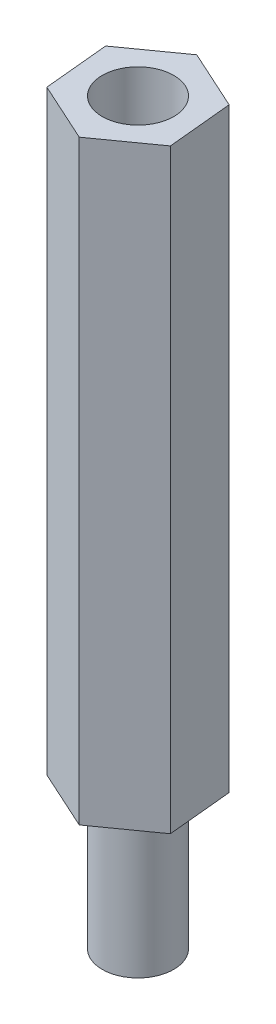
ISO-10303-21;
HEADER;
FILE_DESCRIPTION(('STEP AP214'),'2;1');
FILE_NAME('part.step','',(''),(''),'','','');
FILE_SCHEMA(('AUTOMOTIVE_DESIGN { 1 0 10303 214 1 1 1 1 }'));
ENDSEC;
DATA;
#1=APPLICATION_CONTEXT('core data for automotive mechanical design processes');
#2=APPLICATION_PROTOCOL_DEFINITION('international standard','automotive_design',2000,#1);
#3=PRODUCT_CONTEXT('',#1,'mechanical');
#4=PRODUCT('Part','Part','',(#3));
#5=PRODUCT_RELATED_PRODUCT_CATEGORY('part','',(#4));
#6=PRODUCT_DEFINITION_FORMATION('','',#4);
#7=PRODUCT_DEFINITION_CONTEXT('part definition',#1,'design');
#8=PRODUCT_DEFINITION('design','',#6,#7);
#9=PRODUCT_DEFINITION_SHAPE('','',#8);
#10=(LENGTH_UNIT() NAMED_UNIT(*) SI_UNIT(.MILLI.,.METRE.));
#11=(NAMED_UNIT(*) PLANE_ANGLE_UNIT() SI_UNIT($,.RADIAN.));
#12=(NAMED_UNIT(*) SI_UNIT($,.STERADIAN.) SOLID_ANGLE_UNIT());
#13=UNCERTAINTY_MEASURE_WITH_UNIT(LENGTH_MEASURE(1.E-05),#10,'distance_accuracy_value','');
#14=(GEOMETRIC_REPRESENTATION_CONTEXT(3) GLOBAL_UNCERTAINTY_ASSIGNED_CONTEXT((#13)) GLOBAL_UNIT_ASSIGNED_CONTEXT((#10,
#11,#12)) REPRESENTATION_CONTEXT('',''));
#15=CARTESIAN_POINT('',(0.,0.,0.));
#16=DIRECTION('',(0.,0.,1.));
#17=DIRECTION('',(1.,0.,0.));
#18=AXIS2_PLACEMENT_3D('',#15,#16,#17);
#19=CARTESIAN_POINT('',(0.,6.,0.));
#20=DIRECTION('',(0.,-1.,0.));
#21=DIRECTION('',(0.,0.,-1.));
#22=AXIS2_PLACEMENT_3D('',#19,#20,#21);
#23=CYLINDRICAL_SURFACE('',#22,1.5);
#24=CARTESIAN_POINT('',(0.,6.,0.));
#25=DIRECTION('',(0.,1.,0.));
#26=DIRECTION('',(0.,0.,1.));
#27=AXIS2_PLACEMENT_3D('',#24,#25,#26);
#28=CIRCLE('',#27,1.5);
#29=CARTESIAN_POINT('',(0.,6.,1.5));
#30=VERTEX_POINT('',#29);
#31=EDGE_CURVE('E11',#30,#30,#28,.T.);
#32=ORIENTED_EDGE('',*,*,#31,.F.);
#33=EDGE_LOOP('',(#32));
#34=FACE_BOUND('',#33,.T.);
#35=CARTESIAN_POINT('',(0.,0.,0.));
#36=DIRECTION('',(0.,1.,0.));
#37=DIRECTION('',(0.,0.,1.));
#38=AXIS2_PLACEMENT_3D('',#35,#36,#37);
#39=CIRCLE('',#38,1.5);
#40=CARTESIAN_POINT('',(0.,0.,1.5));
#41=VERTEX_POINT('',#40);
#42=EDGE_CURVE('E38',#41,#41,#39,.T.);
#43=ORIENTED_EDGE('',*,*,#42,.T.);
#44=EDGE_LOOP('',(#43));
#45=FACE_BOUND('',#44,.T.);
#46=ADVANCED_FACE('F35',(#34,#45),#23,.T.);
#47=CARTESIAN_POINT('',(0.,0.,0.));
#48=DIRECTION('',(0.,1.,0.));
#49=DIRECTION('',(0.,0.,1.));
#50=AXIS2_PLACEMENT_3D('',#47,#48,#49);
#51=PLANE('',#50);
#52=ORIENTED_EDGE('',*,*,#42,.F.);
#53=EDGE_LOOP('',(#52));
#54=FACE_BOUND('',#53,.T.);
#55=ADVANCED_FACE('F144',(#54),#51,.F.);
#56=CARTESIAN_POINT('',(0.26355456320684,31.,2.72972019180468));
#57=DIRECTION('',(-0.580913447607673,0.,-0.813965334881386));
#58=DIRECTION('',(-0.813965334881386,0.,0.580913447607673));
#59=AXIS2_PLACEMENT_3D('',#56,#57,#58);
#60=PLANE('',#59);
#61=DIRECTION('',(0.813965334881386,0.,-0.580913447607673));
#62=VECTOR('',#61,1.);
#63=CARTESIAN_POINT('',(0.26355456320684,6.,2.72972019180468));
#64=LINE('',#63,#62);
#65=CARTESIAN_POINT('',(0.26355456320684,6.,2.72972019180468));
#66=VERTEX_POINT('',#65);
#67=CARTESIAN_POINT('',(2.4957843129296,6.,1.1366151488819));
#68=VERTEX_POINT('',#67);
#69=EDGE_CURVE('E120',#66,#68,#64,.T.);
#70=ORIENTED_EDGE('',*,*,#69,.T.);
#71=DIRECTION('',(0.,-1.,0.));
#72=VECTOR('',#71,1.);
#73=CARTESIAN_POINT('',(2.4957843129296,31.,1.1366151488819));
#74=LINE('',#73,#72);
#75=CARTESIAN_POINT('',(2.4957843129296,31.,1.1366151488819));
#76=VERTEX_POINT('',#75);
#77=EDGE_CURVE('E138',#76,#68,#74,.T.);
#78=ORIENTED_EDGE('',*,*,#77,.F.);
#79=DIRECTION('',(0.813965334881386,0.,-0.580913447607673));
#80=VECTOR('',#79,1.);
#81=CARTESIAN_POINT('',(0.26355456320684,31.,2.72972019180468));
#82=LINE('',#81,#80);
#83=CARTESIAN_POINT('',(0.26355456320684,31.,2.72972019180468));
#84=VERTEX_POINT('',#83);
#85=EDGE_CURVE('E131',#84,#76,#82,.T.);
#86=ORIENTED_EDGE('',*,*,#85,.F.);
#87=DIRECTION('',(0.,-1.,0.));
#88=VECTOR('',#87,1.);
#89=CARTESIAN_POINT('',(0.26355456320684,31.,2.72972019180468));
#90=LINE('',#89,#88);
#91=EDGE_CURVE('E116',#84,#66,#90,.T.);
#92=ORIENTED_EDGE('',*,*,#91,.T.);
#93=EDGE_LOOP('',(#70,#78,#86,#92));
#94=FACE_BOUND('',#93,.T.);
#95=ADVANCED_FACE('F146',(#94),#60,.F.);
#96=CARTESIAN_POINT('',(2.4957843129296,31.,1.1366151488819));
#97=DIRECTION('',(-0.995371381611025,0.,0.0961031355875517));
#98=DIRECTION('',(0.0961031355875517,0.,0.995371381611025));
#99=AXIS2_PLACEMENT_3D('',#96,#97,#98);
#100=PLANE('',#99);
#101=DIRECTION('',(-0.0961031355875517,0.,-0.995371381611025));
#102=VECTOR('',#101,1.);
#103=CARTESIAN_POINT('',(2.4957843129296,6.,1.1366151488819));
#104=LINE('',#103,#102);
#105=CARTESIAN_POINT('',(2.23222974972276,6.,-1.59310504292278));
#106=VERTEX_POINT('',#105);
#107=EDGE_CURVE('E123',#68,#106,#104,.T.);
#108=ORIENTED_EDGE('',*,*,#107,.T.);
#109=DIRECTION('',(0.,-1.,0.));
#110=VECTOR('',#109,1.);
#111=CARTESIAN_POINT('',(2.23222974972276,31.,-1.59310504292278));
#112=LINE('',#111,#110);
#113=CARTESIAN_POINT('',(2.23222974972276,31.,-1.59310504292278));
#114=VERTEX_POINT('',#113);
#115=EDGE_CURVE('E135',#114,#106,#112,.T.);
#116=ORIENTED_EDGE('',*,*,#115,.F.);
#117=DIRECTION('',(-0.0961031355875517,0.,-0.995371381611025));
#118=VECTOR('',#117,1.);
#119=CARTESIAN_POINT('',(2.4957843129296,31.,1.1366151488819));
#120=LINE('',#119,#118);
#121=EDGE_CURVE('E89',#76,#114,#120,.T.);
#122=ORIENTED_EDGE('',*,*,#121,.F.);
#123=ORIENTED_EDGE('',*,*,#77,.T.);
#124=EDGE_LOOP('',(#108,#116,#122,#123));
#125=FACE_BOUND('',#124,.T.);
#126=ADVANCED_FACE('F151',(#125),#100,.F.);
#127=CARTESIAN_POINT('',(2.23222974972276,31.,-1.59310504292278));
#128=DIRECTION('',(-0.414457934003352,0.,0.910068470468938));
#129=DIRECTION('',(0.910068470468938,0.,0.414457934003352));
#130=AXIS2_PLACEMENT_3D('',#127,#128,#129);
#131=PLANE('',#130);
#132=DIRECTION('',(-0.910068470468938,0.,-0.414457934003352));
#133=VECTOR('',#132,1.);
#134=CARTESIAN_POINT('',(2.23222974972276,6.,-1.59310504292278));
#135=LINE('',#134,#133);
#136=CARTESIAN_POINT('',(-0.263554563206841,6.,-2.72972019180468));
#137=VERTEX_POINT('',#136);
#138=EDGE_CURVE('E126',#106,#137,#135,.T.);
#139=ORIENTED_EDGE('',*,*,#138,.T.);
#140=DIRECTION('',(0.,-1.,0.));
#141=VECTOR('',#140,1.);
#142=CARTESIAN_POINT('',(-0.263554563206841,31.,-2.72972019180468));
#143=LINE('',#142,#141);
#144=CARTESIAN_POINT('',(-0.263554563206841,31.,-2.72972019180468));
#145=VERTEX_POINT('',#144);
#146=EDGE_CURVE('E111',#145,#137,#143,.T.);
#147=ORIENTED_EDGE('',*,*,#146,.F.);
#148=DIRECTION('',(-0.910068470468938,0.,-0.414457934003352));
#149=VECTOR('',#148,1.);
#150=CARTESIAN_POINT('',(2.23222974972276,31.,-1.59310504292278));
#151=LINE('',#150,#149);
#152=EDGE_CURVE('E102',#114,#145,#151,.T.);
#153=ORIENTED_EDGE('',*,*,#152,.F.);
#154=ORIENTED_EDGE('',*,*,#115,.T.);
#155=EDGE_LOOP('',(#139,#147,#153,#154));
#156=FACE_BOUND('',#155,.T.);
#157=ADVANCED_FACE('F158',(#156),#131,.F.);
#158=CARTESIAN_POINT('',(-0.263554563206841,31.,-2.72972019180468));
#159=DIRECTION('',(0.580913447607673,0.,0.813965334881386));
#160=DIRECTION('',(0.813965334881387,0.,-0.580913447607673));
#161=AXIS2_PLACEMENT_3D('',#158,#159,#160);
#162=PLANE('',#161);
#163=DIRECTION('',(-0.813965334881386,0.,0.580913447607673));
#164=VECTOR('',#163,1.);
#165=CARTESIAN_POINT('',(-0.263554563206841,6.,-2.72972019180468));
#166=LINE('',#165,#164);
#167=CARTESIAN_POINT('',(-2.4957843129296,6.,-1.1366151488819));
#168=VERTEX_POINT('',#167);
#169=EDGE_CURVE('E110',#137,#168,#166,.T.);
#170=ORIENTED_EDGE('',*,*,#169,.T.);
#171=DIRECTION('',(0.,-1.,0.));
#172=VECTOR('',#171,1.);
#173=CARTESIAN_POINT('',(-2.4957843129296,31.,-1.1366151488819));
#174=LINE('',#173,#172);
#175=CARTESIAN_POINT('',(-2.4957843129296,31.,-1.1366151488819));
#176=VERTEX_POINT('',#175);
#177=EDGE_CURVE('E107',#176,#168,#174,.T.);
#178=ORIENTED_EDGE('',*,*,#177,.F.);
#179=DIRECTION('',(-0.813965334881386,0.,0.580913447607673));
#180=VECTOR('',#179,1.);
#181=CARTESIAN_POINT('',(-0.263554563206841,31.,-2.72972019180468));
#182=LINE('',#181,#180);
#183=EDGE_CURVE('E96',#145,#176,#182,.T.);
#184=ORIENTED_EDGE('',*,*,#183,.F.);
#185=ORIENTED_EDGE('',*,*,#146,.T.);
#186=EDGE_LOOP('',(#170,#178,#184,#185));
#187=FACE_BOUND('',#186,.T.);
#188=ADVANCED_FACE('F108',(#187),#162,.F.);
#189=CARTESIAN_POINT('',(-2.4957843129296,31.,-1.1366151488819));
#190=DIRECTION('',(0.995371381611025,0.,-0.0961031355875518));
#191=DIRECTION('',(-0.0961031355875518,0.,-0.995371381611025));
#192=AXIS2_PLACEMENT_3D('',#189,#190,#191);
#193=PLANE('',#192);
#194=DIRECTION('',(0.0961031355875518,0.,0.995371381611025));
#195=VECTOR('',#194,1.);
#196=CARTESIAN_POINT('',(-2.4957843129296,6.,-1.1366151488819));
#197=LINE('',#196,#195);
#198=CARTESIAN_POINT('',(-2.23222974972276,6.,1.59310504292278));
#199=VERTEX_POINT('',#198);
#200=EDGE_CURVE('E74',#168,#199,#197,.T.);
#201=ORIENTED_EDGE('',*,*,#200,.T.);
#202=DIRECTION('',(0.,-1.,0.));
#203=VECTOR('',#202,1.);
#204=CARTESIAN_POINT('',(-2.23222974972276,31.,1.59310504292278));
#205=LINE('',#204,#203);
#206=CARTESIAN_POINT('',(-2.23222974972276,31.,1.59310504292278));
#207=VERTEX_POINT('',#206);
#208=EDGE_CURVE('E112',#207,#199,#205,.T.);
#209=ORIENTED_EDGE('',*,*,#208,.F.);
#210=DIRECTION('',(0.0961031355875518,0.,0.995371381611025));
#211=VECTOR('',#210,1.);
#212=CARTESIAN_POINT('',(-2.4957843129296,31.,-1.1366151488819));
#213=LINE('',#212,#211);
#214=EDGE_CURVE('E100',#176,#207,#213,.T.);
#215=ORIENTED_EDGE('',*,*,#214,.F.);
#216=ORIENTED_EDGE('',*,*,#177,.T.);
#217=EDGE_LOOP('',(#201,#209,#215,#216));
#218=FACE_BOUND('',#217,.T.);
#219=ADVANCED_FACE('F114',(#218),#193,.F.);
#220=CARTESIAN_POINT('',(-2.23222974972276,31.,1.59310504292278));
#221=DIRECTION('',(0.414457934003352,0.,-0.910068470468938));
#222=DIRECTION('',(-0.910068470468938,0.,-0.414457934003353));
#223=AXIS2_PLACEMENT_3D('',#220,#221,#222);
#224=PLANE('',#223);
#225=DIRECTION('',(0.910068470468938,0.,0.414457934003352));
#226=VECTOR('',#225,1.);
#227=CARTESIAN_POINT('',(-2.23222974972276,6.,1.59310504292278));
#228=LINE('',#227,#226);
#229=EDGE_CURVE('E80',#199,#66,#228,.T.);
#230=ORIENTED_EDGE('',*,*,#229,.T.);
#231=ORIENTED_EDGE('',*,*,#91,.F.);
#232=DIRECTION('',(0.910068470468938,0.,0.414457934003352));
#233=VECTOR('',#232,1.);
#234=CARTESIAN_POINT('',(-2.23222974972276,31.,1.59310504292278));
#235=LINE('',#234,#233);
#236=EDGE_CURVE('E51',#207,#84,#235,.T.);
#237=ORIENTED_EDGE('',*,*,#236,.F.);
#238=ORIENTED_EDGE('',*,*,#208,.T.);
#239=EDGE_LOOP('',(#230,#231,#237,#238));
#240=FACE_BOUND('',#239,.T.);
#241=ADVANCED_FACE('F166',(#240),#224,.F.);
#242=CARTESIAN_POINT('',(0.,31.,0.));
#243=DIRECTION('',(0.,1.,0.));
#244=DIRECTION('',(0.,0.,1.));
#245=AXIS2_PLACEMENT_3D('',#242,#243,#244);
#246=PLANE('',#245);
#247=CARTESIAN_POINT('',(0.,31.,0.));
#248=DIRECTION('',(0.,1.,0.));
#249=DIRECTION('',(0.,0.,1.));
#250=AXIS2_PLACEMENT_3D('',#247,#248,#249);
#251=CIRCLE('',#250,1.5);
#252=CARTESIAN_POINT('',(0.,31.,1.5));
#253=VERTEX_POINT('',#252);
#254=EDGE_CURVE('E187',#253,#253,#251,.T.);
#255=ORIENTED_EDGE('',*,*,#254,.F.);
#256=EDGE_LOOP('',(#255));
#257=FACE_BOUND('',#256,.T.);
#258=ORIENTED_EDGE('',*,*,#85,.T.);
#259=ORIENTED_EDGE('',*,*,#121,.T.);
#260=ORIENTED_EDGE('',*,*,#152,.T.);
#261=ORIENTED_EDGE('',*,*,#183,.T.);
#262=ORIENTED_EDGE('',*,*,#214,.T.);
#263=ORIENTED_EDGE('',*,*,#236,.T.);
#264=EDGE_LOOP('',(#258,#259,#260,#261,#262,#263));
#265=FACE_BOUND('',#264,.T.);
#266=ADVANCED_FACE('F98',(#257,#265),#246,.T.);
#267=CARTESIAN_POINT('',(0.,6.,0.));
#268=DIRECTION('',(0.,1.,0.));
#269=DIRECTION('',(0.,0.,1.));
#270=AXIS2_PLACEMENT_3D('',#267,#268,#269);
#271=PLANE('',#270);
#272=ORIENTED_EDGE('',*,*,#31,.T.);
#273=EDGE_LOOP('',(#272));
#274=FACE_BOUND('',#273,.T.);
#275=ORIENTED_EDGE('',*,*,#69,.F.);
#276=ORIENTED_EDGE('',*,*,#229,.F.);
#277=ORIENTED_EDGE('',*,*,#200,.F.);
#278=ORIENTED_EDGE('',*,*,#169,.F.);
#279=ORIENTED_EDGE('',*,*,#138,.F.);
#280=ORIENTED_EDGE('',*,*,#107,.F.);
#281=EDGE_LOOP('',(#275,#276,#277,#278,#279,#280));
#282=FACE_BOUND('',#281,.T.);
#283=ADVANCED_FACE('F169',(#274,#282),#271,.F.);
#284=CARTESIAN_POINT('',(0.,26.,0.));
#285=DIRECTION('',(0.,1.,0.));
#286=DIRECTION('',(0.,0.,1.));
#287=AXIS2_PLACEMENT_3D('',#284,#285,#286);
#288=CYLINDRICAL_SURFACE('',#287,1.5);
#289=CARTESIAN_POINT('',(0.,26.,0.));
#290=DIRECTION('',(0.,1.,0.));
#291=DIRECTION('',(0.,0.,1.));
#292=AXIS2_PLACEMENT_3D('',#289,#290,#291);
#293=CIRCLE('',#292,1.5);
#294=CARTESIAN_POINT('',(0.,26.,1.5));
#295=VERTEX_POINT('',#294);
#296=EDGE_CURVE('E124',#295,#295,#293,.T.);
#297=ORIENTED_EDGE('',*,*,#296,.F.);
#298=EDGE_LOOP('',(#297));
#299=FACE_BOUND('',#298,.T.);
#300=ORIENTED_EDGE('',*,*,#254,.T.);
#301=EDGE_LOOP('',(#300));
#302=FACE_BOUND('',#301,.T.);
#303=ADVANCED_FACE('F172',(#299,#302),#288,.F.);
#304=CARTESIAN_POINT('',(0.,26.,0.));
#305=DIRECTION('',(0.,1.,0.));
#306=DIRECTION('',(0.,0.,1.));
#307=AXIS2_PLACEMENT_3D('',#304,#305,#306);
#308=PLANE('',#307);
#309=ORIENTED_EDGE('',*,*,#296,.T.);
#310=EDGE_LOOP('',(#309));
#311=FACE_BOUND('',#310,.T.);
#312=ADVANCED_FACE('F179',(#311),#308,.T.);
#313=CLOSED_SHELL('',(#46,#55,#95,#126,#157,#188,#219,#241,#266,#283,#303,#312));
#314=MANIFOLD_SOLID_BREP('B2',#313);
#315=ADVANCED_BREP_SHAPE_REPRESENTATION('',(#18,#314),#14);
#316=SHAPE_DEFINITION_REPRESENTATION(#9,#315);
ENDSEC;
END-ISO-10303-21;
